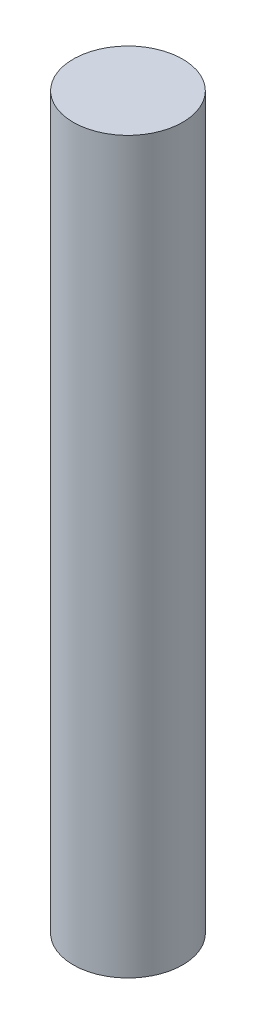
ISO-10303-21;
HEADER;
FILE_DESCRIPTION(('STEP AP214'),'2;1');
FILE_NAME('part.step','',(''),(''),'','','');
FILE_SCHEMA(('AUTOMOTIVE_DESIGN { 1 0 10303 214 1 1 1 1 }'));
ENDSEC;
DATA;
#1=APPLICATION_CONTEXT('core data for automotive mechanical design processes');
#2=APPLICATION_PROTOCOL_DEFINITION('international standard','automotive_design',2000,#1);
#3=PRODUCT_CONTEXT('',#1,'mechanical');
#4=PRODUCT('Part','Part','',(#3));
#5=PRODUCT_RELATED_PRODUCT_CATEGORY('part','',(#4));
#6=PRODUCT_DEFINITION_FORMATION('','',#4);
#7=PRODUCT_DEFINITION_CONTEXT('part definition',#1,'design');
#8=PRODUCT_DEFINITION('design','',#6,#7);
#9=PRODUCT_DEFINITION_SHAPE('','',#8);
#10=(LENGTH_UNIT() NAMED_UNIT(*) SI_UNIT(.MILLI.,.METRE.));
#11=(NAMED_UNIT(*) PLANE_ANGLE_UNIT() SI_UNIT($,.RADIAN.));
#12=(NAMED_UNIT(*) SI_UNIT($,.STERADIAN.) SOLID_ANGLE_UNIT());
#13=UNCERTAINTY_MEASURE_WITH_UNIT(LENGTH_MEASURE(1.E-05),#10,'distance_accuracy_value','');
#14=(GEOMETRIC_REPRESENTATION_CONTEXT(3) GLOBAL_UNCERTAINTY_ASSIGNED_CONTEXT((#13)) GLOBAL_UNIT_ASSIGNED_CONTEXT((#10,
#11,#12)) REPRESENTATION_CONTEXT('',''));
#15=CARTESIAN_POINT('',(0.,0.,0.));
#16=DIRECTION('',(0.,0.,1.));
#17=DIRECTION('',(1.,0.,0.));
#18=AXIS2_PLACEMENT_3D('',#15,#16,#17);
#19=CARTESIAN_POINT('',(0.,100.,0.));
#20=DIRECTION('',(0.,-1.,0.));
#21=DIRECTION('',(0.,0.,-1.));
#22=AXIS2_PLACEMENT_3D('',#19,#20,#21);
#23=CYLINDRICAL_SURFACE('',#22,7.5);
#24=CARTESIAN_POINT('',(0.,42.,-7.5));
#25=CARTESIAN_POINT('',(-0.110254555832854,41.9999973830651,-7.49999833810161));
#26=CARTESIAN_POINT('',(-0.22053716022184,41.9908523858103,-7.49754486162151));
#27=CARTESIAN_POINT('',(-0.437925451354463,41.9545787692613,-7.48799573621659));
#28=CARTESIAN_POINT('',(-0.545029583319087,41.9274414955739,-7.48089785332586));
#29=CARTESIAN_POINT('',(-0.752891589045311,41.856128333136,-7.4628433325279));
#30=CARTESIAN_POINT('',(-0.853657451015283,41.811974412334,-7.45189167130375));
#31=CARTESIAN_POINT('',(-1.04635368639266,41.7079627573334,-7.42728699151678));
#32=CARTESIAN_POINT('',(-1.13828347044962,41.6481039766407,-7.4136337929518));
#33=CARTESIAN_POINT('',(-1.31282950374001,41.5129164835866,-7.38474614901995));
#34=CARTESIAN_POINT('',(-1.39521168986278,41.4372913319917,-7.36948467678681));
#35=CARTESIAN_POINT('',(-1.54628713660638,41.2733515169366,-7.33927409679591));
#36=CARTESIAN_POINT('',(-1.61497863495664,41.1850352223825,-7.32432502947243));
#37=CARTESIAN_POINT('',(-1.73786409243415,40.9963517651746,-7.29615537464372));
#38=CARTESIAN_POINT('',(-1.79178877736487,40.8958036717383,-7.28296888563239));
#39=CARTESIAN_POINT('',(-1.88187548076994,40.6866598889076,-7.26021477318187));
#40=CARTESIAN_POINT('',(-1.91804077451369,40.5780656876686,-7.25064648253265));
#41=CARTESIAN_POINT('',(-1.97076920226504,40.358504462175,-7.23649115802399));
#42=CARTESIAN_POINT('',(-1.98775670244692,40.2476464600693,-7.2317964781149));
#43=CARTESIAN_POINT('',(-2.0029703470582,40.0245623166935,-7.22759830916371));
#44=CARTESIAN_POINT('',(-2.00119999705754,39.9123364349759,-7.22809385014446));
#45=CARTESIAN_POINT('',(-1.97928510002699,39.6930145846259,-7.2341237880203));
#46=CARTESIAN_POINT('',(-1.95965406064765,39.5858628179615,-7.23951735511531));
#47=CARTESIAN_POINT('',(-1.90339748722183,39.3764316655438,-7.25451013080688));
#48=CARTESIAN_POINT('',(-1.86677059492995,39.2741526699247,-7.26410967552612));
#49=CARTESIAN_POINT('',(-1.77714356965256,39.0760318561914,-7.28655661748386));
#50=CARTESIAN_POINT('',(-1.72396341137785,38.9802756607138,-7.29943942818703));
#51=CARTESIAN_POINT('',(-1.60286503823778,38.7988658411485,-7.32698229642445));
#52=CARTESIAN_POINT('',(-1.53494392224252,38.7132142108435,-7.34164270355186));
#53=CARTESIAN_POINT('',(-1.38366607263419,38.5515110025452,-7.37167510629864));
#54=CARTESIAN_POINT('',(-1.29987812728299,38.475863681685,-7.38705471488831));
#55=CARTESIAN_POINT('',(-1.12061766820637,38.3396112196497,-7.41636381276316));
#56=CARTESIAN_POINT('',(-1.02514469420509,38.2790066712976,-7.43029324488555));
#57=CARTESIAN_POINT('',(-0.824598255497449,38.1743820971753,-7.45521820398293));
#58=CARTESIAN_POINT('',(-0.719484902551787,38.1304352295514,-7.4662007283356));
#59=CARTESIAN_POINT('',(-0.503002294390394,38.0609528111866,-7.48390044400999));
#60=CARTESIAN_POINT('',(-0.391634411928323,38.035413237276,-7.49061856733749));
#61=CARTESIAN_POINT('',(-0.169254083145516,38.0041051230822,-7.49889158558384));
#62=CARTESIAN_POINT('',(-0.0583242376413809,37.9977869601491,-7.50058997470959));
#63=CARTESIAN_POINT('',(0.163010045901198,38.0035831642469,-7.49904471691695));
#64=CARTESIAN_POINT('',(0.273414537062114,38.0156956261058,-7.49580158080353));
#65=CARTESIAN_POINT('',(0.488602449901779,38.05755844746,-7.48483035496021));
#66=CARTESIAN_POINT('',(0.59344985202778,38.0870022461978,-7.47718026546329));
#67=CARTESIAN_POINT('',(0.796706971176063,38.162335944508,-7.45826294894139));
#68=CARTESIAN_POINT('',(0.895115989216027,38.2082276262505,-7.44699532996161));
#69=CARTESIAN_POINT('',(1.08483847466795,38.3161738871805,-7.42175660559528));
#70=CARTESIAN_POINT('',(1.17597518846118,38.3785274667977,-7.40773686604957));
#71=CARTESIAN_POINT('',(1.34668463539715,38.517251630158,-7.37861452365564));
#72=CARTESIAN_POINT('',(1.42625507879918,38.5936249826011,-7.3635117072752));
#73=CARTESIAN_POINT('',(1.57388924478774,38.7607855774946,-7.33339745866705));
#74=CARTESIAN_POINT('',(1.64156519249816,38.8519185613952,-7.31840061429312));
#75=CARTESIAN_POINT('',(1.76067191185118,39.0445646960996,-7.29066447182727));
#76=CARTESIAN_POINT('',(1.81210336122161,39.1460774136223,-7.27792507956316));
#77=CARTESIAN_POINT('',(1.89687411586112,39.3560953070761,-7.2562926837321));
#78=CARTESIAN_POINT('',(1.93031812253958,39.4645558118176,-7.24737748318009));
#79=CARTESIAN_POINT('',(1.97841205118791,39.6858393196747,-7.23439825126801));
#80=CARTESIAN_POINT('',(1.99306677602478,39.7986612003479,-7.23033298020014));
#81=CARTESIAN_POINT('',(2.00288989653714,40.0214947878838,-7.22761744573588));
#82=CARTESIAN_POINT('',(1.99868155618109,40.1314773202583,-7.22879397743239));
#83=CARTESIAN_POINT('',(1.97234376000439,40.34910351401,-7.23602396081087));
#84=CARTESIAN_POINT('',(1.95021476535026,40.4567472355006,-7.24207728699439));
#85=CARTESIAN_POINT('',(1.88902515699699,40.6658557521298,-7.25827571073158));
#86=CARTESIAN_POINT('',(1.8500966107558,40.7673618427322,-7.26838885019644));
#87=CARTESIAN_POINT('',(1.75651554562386,40.9624788305341,-7.29156818136177));
#88=CARTESIAN_POINT('',(1.70186056024617,41.0560884863005,-7.30463483621364));
#89=CARTESIAN_POINT('',(1.57648909268817,41.2357303594966,-7.3327292144046));
#90=CARTESIAN_POINT('',(1.50534729767909,41.3214585349762,-7.3478033310169));
#91=CARTESIAN_POINT('',(1.349830535111,41.4799624516673,-7.37795503783008));
#92=CARTESIAN_POINT('',(1.26545235435874,41.5527350386688,-7.39303262798441));
#93=CARTESIAN_POINT('',(1.08367998108868,41.6847922376469,-7.42187812403968));
#94=CARTESIAN_POINT('',(0.98604596175178,41.7437550106493,-7.43561111314551));
#95=CARTESIAN_POINT('',(0.781888640416889,41.8443374159294,-7.45983810102897));
#96=CARTESIAN_POINT('',(0.675371094696296,41.8859681756636,-7.47033417683594));
#97=CARTESIAN_POINT('',(0.474374704880989,41.9452752854155,-7.48554752513468));
#98=CARTESIAN_POINT('',(0.380762016565035,41.9657493835925,-7.49092770592602));
#99=CARTESIAN_POINT('',(0.191439795317076,41.9931122061671,-7.49815449036456));
#100=CARTESIAN_POINT('',(0.0957304704048599,42.0000022722,-7.5000014429727));
#101=CARTESIAN_POINT('',(0.,42.,-7.5));
#102=B_SPLINE_CURVE_WITH_KNOTS('',3,(#24,#25,#26,#27,#28,#29,#30,#31,#32,#33,#34,#35,#36,#37,
#38,#39,#40,#41,#42,#43,#44,#45,#46,#47,#48,#49,#50,#51,#52,#53,#54,#55,#56,#57,#58,#59,#60,#61,
#62,#63,#64,#65,#66,#67,#68,#69,#70,#71,#72,#73,#74,#75,#76,#77,#78,#79,#80,#81,#82,#83,#84,#85,
#86,#87,#88,#89,#90,#91,#92,#93,#94,#95,#96,#97,#98,#99,#100,#101),.UNSPECIFIED.,.T.,.F.,(4,2,2,
2,2,2,2,2,2,2,2,2,2,2,2,2,2,2,2,2,2,2,2,2,2,2,2,2,2,2,2,2,2,2,2,2,2,2,4),(0.,0.330412598949569,
0.66098424376145,0.991130552971928,1.32129886708675,1.65834897954966,1.99544244925149,
2.33832582523229,2.68114594129699,3.01622158250469,3.35123460404321,3.67691002045997,
4.0026114681294,4.33198673346498,4.6614268811763,5.00161259812322,5.34181171937598,
5.68348809603042,6.02508977190139,6.35682717524547,6.68853028925351,7.01453535642116,
7.34057575775615,7.6730028600455,8.00549568258887,8.34736496382789,8.68921998024108,
9.02906297699387,9.36881908663983,9.69743342403612,10.0260393052059,10.352107654483,
10.67822717123,11.0139433957139,11.3497412433245,11.692722522809,12.0354832614518,
12.3223981899334,12.6092847796638),.UNSPECIFIED.);
#103=CARTESIAN_POINT('',(0.,42.,-7.5));
#104=VERTEX_POINT('',#103);
#105=EDGE_CURVE('E38',#104,#104,#102,.T.);
#106=ORIENTED_EDGE('',*,*,#105,.T.);
#107=EDGE_LOOP('',(#106));
#108=FACE_BOUND('',#107,.T.);
#109=CARTESIAN_POINT('',(0.,62.,-7.5));
#110=CARTESIAN_POINT('',(-0.110254555832854,61.9999973830651,-7.49999833810161));
#111=CARTESIAN_POINT('',(-0.22053716022184,61.9908523858103,-7.49754486162151));
#112=CARTESIAN_POINT('',(-0.437925451354464,61.9545787692613,-7.48799573621659));
#113=CARTESIAN_POINT('',(-0.545029583319087,61.9274414955739,-7.48089785332586));
#114=CARTESIAN_POINT('',(-0.752891589045312,61.856128333136,-7.4628433325279));
#115=CARTESIAN_POINT('',(-0.853657451015283,61.811974412334,-7.45189167130375));
#116=CARTESIAN_POINT('',(-1.04635368639266,61.7079627573334,-7.42728699151678));
#117=CARTESIAN_POINT('',(-1.13828347044963,61.6481039766407,-7.4136337929518));
#118=CARTESIAN_POINT('',(-1.31282950374002,61.5129164835866,-7.38474614901995));
#119=CARTESIAN_POINT('',(-1.39521168986279,61.4372913319917,-7.36948467678681));
#120=CARTESIAN_POINT('',(-1.54628713660638,61.2733515169366,-7.33927409679591));
#121=CARTESIAN_POINT('',(-1.61497863495664,61.1850352223825,-7.32432502947243));
#122=CARTESIAN_POINT('',(-1.73786409243415,60.9963517651746,-7.29615537464372));
#123=CARTESIAN_POINT('',(-1.79178877736487,60.8958036717383,-7.28296888563239));
#124=CARTESIAN_POINT('',(-1.88187548076994,60.6866598889076,-7.26021477318187));
#125=CARTESIAN_POINT('',(-1.91804077451369,60.5780656876686,-7.25064648253265));
#126=CARTESIAN_POINT('',(-1.97076920226504,60.358504462175,-7.23649115802399));
#127=CARTESIAN_POINT('',(-1.98775670244692,60.2476464600693,-7.2317964781149));
#128=CARTESIAN_POINT('',(-2.0029703470582,60.0245623166935,-7.22759830916371));
#129=CARTESIAN_POINT('',(-2.00119999705754,59.9123364349759,-7.22809385014446));
#130=CARTESIAN_POINT('',(-1.97928510002699,59.6930145846259,-7.2341237880203));
#131=CARTESIAN_POINT('',(-1.95965406064765,59.5858628179615,-7.23951735511531));
#132=CARTESIAN_POINT('',(-1.90339748722183,59.3764316655438,-7.25451013080688));
#133=CARTESIAN_POINT('',(-1.86677059492995,59.2741526699247,-7.26410967552612));
#134=CARTESIAN_POINT('',(-1.77714356965256,59.0760318561914,-7.28655661748386));
#135=CARTESIAN_POINT('',(-1.72396341137785,58.9802756607137,-7.29943942818703));
#136=CARTESIAN_POINT('',(-1.60286503823778,58.7988658411485,-7.32698229642445));
#137=CARTESIAN_POINT('',(-1.53494392224252,58.7132142108435,-7.34164270355186));
#138=CARTESIAN_POINT('',(-1.38366607263419,58.5515110025452,-7.37167510629864));
#139=CARTESIAN_POINT('',(-1.29987812728299,58.475863681685,-7.38705471488831));
#140=CARTESIAN_POINT('',(-1.12061766820637,58.3396112196497,-7.41636381276316));
#141=CARTESIAN_POINT('',(-1.02514469420509,58.2790066712976,-7.43029324488555));
#142=CARTESIAN_POINT('',(-0.82459825549745,58.1743820971753,-7.45521820398293));
#143=CARTESIAN_POINT('',(-0.719484902551788,58.1304352295514,-7.4662007283356));
#144=CARTESIAN_POINT('',(-0.503002294390397,58.0609528111866,-7.48390044400999));
#145=CARTESIAN_POINT('',(-0.391634411928325,58.035413237276,-7.49061856733749));
#146=CARTESIAN_POINT('',(-0.169254083145518,58.0041051230822,-7.49889158558384));
#147=CARTESIAN_POINT('',(-0.0583242376413822,57.9977869601491,-7.50058997470959));
#148=CARTESIAN_POINT('',(0.163010045901198,58.0035831642469,-7.49904471691695));
#149=CARTESIAN_POINT('',(0.273414537062113,58.0156956261058,-7.49580158080353));
#150=CARTESIAN_POINT('',(0.48860244990178,58.05755844746,-7.48483035496021));
#151=CARTESIAN_POINT('',(0.593449852027783,58.0870022461978,-7.47718026546329));
#152=CARTESIAN_POINT('',(0.796706971176065,58.1623359445079,-7.45826294894139));
#153=CARTESIAN_POINT('',(0.895115989216027,58.2082276262505,-7.44699532996161));
#154=CARTESIAN_POINT('',(1.08483847466795,58.3161738871805,-7.42175660559528));
#155=CARTESIAN_POINT('',(1.17597518846118,58.3785274667977,-7.40773686604957));
#156=CARTESIAN_POINT('',(1.34668463539715,58.517251630158,-7.37861452365564));
#157=CARTESIAN_POINT('',(1.42625507879918,58.593624982601,-7.3635117072752));
#158=CARTESIAN_POINT('',(1.57388924478774,58.7607855774946,-7.33339745866705));
#159=CARTESIAN_POINT('',(1.64156519249816,58.8519185613952,-7.31840061429312));
#160=CARTESIAN_POINT('',(1.76067191185118,59.0445646960996,-7.29066447182727));
#161=CARTESIAN_POINT('',(1.81210336122161,59.1460774136223,-7.27792507956316));
#162=CARTESIAN_POINT('',(1.89687411586112,59.3560953070761,-7.2562926837321));
#163=CARTESIAN_POINT('',(1.93031812253958,59.4645558118176,-7.24737748318009));
#164=CARTESIAN_POINT('',(1.97841205118791,59.6858393196747,-7.234398251268));
#165=CARTESIAN_POINT('',(1.99306677602478,59.7986612003479,-7.23033298020014));
#166=CARTESIAN_POINT('',(2.00288989653714,60.0214947878838,-7.22761744573589));
#167=CARTESIAN_POINT('',(1.99868155618109,60.1314773202583,-7.22879397743239));
#168=CARTESIAN_POINT('',(1.97234376000439,60.34910351401,-7.23602396081087));
#169=CARTESIAN_POINT('',(1.95021476535026,60.4567472355006,-7.24207728699439));
#170=CARTESIAN_POINT('',(1.88902515699699,60.6658557521298,-7.25827571073158));
#171=CARTESIAN_POINT('',(1.8500966107558,60.7673618427322,-7.26838885019644));
#172=CARTESIAN_POINT('',(1.75651554562386,60.9624788305341,-7.29156818136177));
#173=CARTESIAN_POINT('',(1.70186056024617,61.0560884863005,-7.30463483621364));
#174=CARTESIAN_POINT('',(1.57648909268817,61.2357303594966,-7.3327292144046));
#175=CARTESIAN_POINT('',(1.50534729767909,61.3214585349762,-7.3478033310169));
#176=CARTESIAN_POINT('',(1.349830535111,61.4799624516673,-7.37795503783008));
#177=CARTESIAN_POINT('',(1.26545235435875,61.5527350386688,-7.39303262798441));
#178=CARTESIAN_POINT('',(1.08367998108869,61.6847922376469,-7.42187812403968));
#179=CARTESIAN_POINT('',(0.986045961751781,61.7437550106493,-7.43561111314551));
#180=CARTESIAN_POINT('',(0.781888640416889,61.8443374159294,-7.45983810102897));
#181=CARTESIAN_POINT('',(0.675371094696296,61.8859681756636,-7.47033417683594));
#182=CARTESIAN_POINT('',(0.474374704880989,61.9452752854155,-7.48554752513468));
#183=CARTESIAN_POINT('',(0.380762016565035,61.9657493835925,-7.49092770592602));
#184=CARTESIAN_POINT('',(0.191439795317076,61.9931122061671,-7.49815449036456));
#185=CARTESIAN_POINT('',(0.0957304704048602,62.0000022722,-7.5000014429727));
#186=CARTESIAN_POINT('',(0.,62.,-7.5));
#187=B_SPLINE_CURVE_WITH_KNOTS('',3,(#109,#110,#111,#112,#113,#114,#115,#116,#117,#118,#119,
#120,#121,#122,#123,#124,#125,#126,#127,#128,#129,#130,#131,#132,#133,#134,#135,#136,#137,#138,
#139,#140,#141,#142,#143,#144,#145,#146,#147,#148,#149,#150,#151,#152,#153,#154,#155,#156,#157,
#158,#159,#160,#161,#162,#163,#164,#165,#166,#167,#168,#169,#170,#171,#172,#173,#174,#175,#176,
#177,#178,#179,#180,#181,#182,#183,#184,#185,#186),.UNSPECIFIED.,.T.,.F.,(4,2,2,2,2,2,2,2,2,2,2,
2,2,2,2,2,2,2,2,2,2,2,2,2,2,2,2,2,2,2,2,2,2,2,2,2,2,2,4),(0.,0.330412598949569,0.66098424376145,
0.991130552971933,1.32129886708675,1.65834897954967,1.99544244925149,2.33832582523229,
2.681145941297,3.01622158250469,3.3512346040432,3.67691002045997,4.0026114681294,
4.33198673346498,4.6614268811763,5.00161259812323,5.34181171937598,5.68348809603042,
6.02508977190139,6.35682717524547,6.68853028925351,7.01453535642116,7.34057575775615,
7.6730028600455,8.00549568258887,8.34736496382789,8.68921998024108,9.02906297699387,
9.36881908663983,9.69743342403611,10.0260393052059,10.352107654483,10.67822717123,
11.0139433957139,11.3497412433245,11.692722522809,12.0354832614518,12.3223981899334,
12.6092847796638),.UNSPECIFIED.);
#188=CARTESIAN_POINT('',(0.,62.,-7.5));
#189=VERTEX_POINT('',#188);
#190=EDGE_CURVE('E55',#189,#189,#187,.T.);
#191=ORIENTED_EDGE('',*,*,#190,.T.);
#192=EDGE_LOOP('',(#191));
#193=FACE_BOUND('',#192,.T.);
#194=CARTESIAN_POINT('',(0.,100.,0.));
#195=DIRECTION('',(0.,1.,0.));
#196=DIRECTION('',(0.,0.,1.));
#197=AXIS2_PLACEMENT_3D('',#194,#195,#196);
#198=CIRCLE('',#197,7.5);
#199=CARTESIAN_POINT('',(0.,100.,7.5));
#200=VERTEX_POINT('',#199);
#201=EDGE_CURVE('E10',#200,#200,#198,.T.);
#202=ORIENTED_EDGE('',*,*,#201,.F.);
#203=EDGE_LOOP('',(#202));
#204=FACE_BOUND('',#203,.T.);
#205=CARTESIAN_POINT('',(0.,0.,0.));
#206=DIRECTION('',(0.,1.,0.));
#207=DIRECTION('',(0.,0.,1.));
#208=AXIS2_PLACEMENT_3D('',#205,#206,#207);
#209=CIRCLE('',#208,7.5);
#210=CARTESIAN_POINT('',(0.,0.,7.5));
#211=VERTEX_POINT('',#210);
#212=EDGE_CURVE('E46',#211,#211,#209,.T.);
#213=ORIENTED_EDGE('',*,*,#212,.T.);
#214=EDGE_LOOP('',(#213));
#215=FACE_BOUND('',#214,.T.);
#216=ADVANCED_FACE('F34',(#108,#193,#204,#215),#23,.T.);
#217=CARTESIAN_POINT('',(0.,100.,0.));
#218=DIRECTION('',(0.,1.,0.));
#219=DIRECTION('',(0.,0.,1.));
#220=AXIS2_PLACEMENT_3D('',#217,#218,#219);
#221=PLANE('',#220);
#222=ORIENTED_EDGE('',*,*,#201,.T.);
#223=EDGE_LOOP('',(#222));
#224=FACE_BOUND('',#223,.T.);
#225=ADVANCED_FACE('F70',(#224),#221,.T.);
#226=CARTESIAN_POINT('',(0.,0.,0.));
#227=DIRECTION('',(0.,1.,0.));
#228=DIRECTION('',(0.,0.,1.));
#229=AXIS2_PLACEMENT_3D('',#226,#227,#228);
#230=PLANE('',#229);
#231=ORIENTED_EDGE('',*,*,#212,.F.);
#232=EDGE_LOOP('',(#231));
#233=FACE_BOUND('',#232,.T.);
#234=ADVANCED_FACE('F68',(#233),#230,.F.);
#235=CARTESIAN_POINT('',(0.,60.,-10.));
#236=DIRECTION('',(0.,0.,1.));
#237=DIRECTION('',(1.,0.,0.));
#238=AXIS2_PLACEMENT_3D('',#235,#236,#237);
#239=CYLINDRICAL_SURFACE('',#238,2.);
#240=CARTESIAN_POINT('',(0.,60.,0.));
#241=DIRECTION('',(0.,0.,1.));
#242=DIRECTION('',(1.,0.,0.));
#243=AXIS2_PLACEMENT_3D('',#240,#241,#242);
#244=CIRCLE('',#243,2.);
#245=CARTESIAN_POINT('',(2.,60.,0.));
#246=VERTEX_POINT('',#245);
#247=EDGE_CURVE('E53',#246,#246,#244,.T.);
#248=ORIENTED_EDGE('',*,*,#247,.T.);
#249=EDGE_LOOP('',(#248));
#250=FACE_BOUND('',#249,.T.);
#251=ORIENTED_EDGE('',*,*,#190,.F.);
#252=EDGE_LOOP('',(#251));
#253=FACE_BOUND('',#252,.T.);
#254=ADVANCED_FACE('F62',(#250,#253),#239,.F.);
#255=CARTESIAN_POINT('',(0.,60.,0.));
#256=DIRECTION('',(0.,0.,1.));
#257=DIRECTION('',(1.,0.,0.));
#258=AXIS2_PLACEMENT_3D('',#255,#256,#257);
#259=PLANE('',#258);
#260=ORIENTED_EDGE('',*,*,#247,.F.);
#261=EDGE_LOOP('',(#260));
#262=FACE_BOUND('',#261,.T.);
#263=ADVANCED_FACE('F67',(#262),#259,.F.);
#264=CARTESIAN_POINT('',(0.,40.,-10.));
#265=DIRECTION('',(0.,0.,1.));
#266=DIRECTION('',(1.,0.,0.));
#267=AXIS2_PLACEMENT_3D('',#264,#265,#266);
#268=CYLINDRICAL_SURFACE('',#267,2.);
#269=CARTESIAN_POINT('',(0.,40.,0.));
#270=DIRECTION('',(0.,0.,1.));
#271=DIRECTION('',(1.,0.,0.));
#272=AXIS2_PLACEMENT_3D('',#269,#270,#271);
#273=CIRCLE('',#272,2.);
#274=CARTESIAN_POINT('',(2.,40.,0.));
#275=VERTEX_POINT('',#274);
#276=EDGE_CURVE('E61',#275,#275,#273,.T.);
#277=ORIENTED_EDGE('',*,*,#276,.T.);
#278=EDGE_LOOP('',(#277));
#279=FACE_BOUND('',#278,.T.);
#280=ORIENTED_EDGE('',*,*,#105,.F.);
#281=EDGE_LOOP('',(#280));
#282=FACE_BOUND('',#281,.T.);
#283=ADVANCED_FACE('F90',(#279,#282),#268,.F.);
#284=CARTESIAN_POINT('',(0.,40.,0.));
#285=DIRECTION('',(0.,0.,1.));
#286=DIRECTION('',(1.,0.,0.));
#287=AXIS2_PLACEMENT_3D('',#284,#285,#286);
#288=PLANE('',#287);
#289=ORIENTED_EDGE('',*,*,#276,.F.);
#290=EDGE_LOOP('',(#289));
#291=FACE_BOUND('',#290,.T.);
#292=ADVANCED_FACE('F92',(#291),#288,.F.);
#293=CLOSED_SHELL('',(#216,#225,#234,#254,#263,#283,#292));
#294=MANIFOLD_SOLID_BREP('B2',#293);
#295=ADVANCED_BREP_SHAPE_REPRESENTATION('',(#18,#294),#14);
#296=SHAPE_DEFINITION_REPRESENTATION(#9,#295);
ENDSEC;
END-ISO-10303-21;
